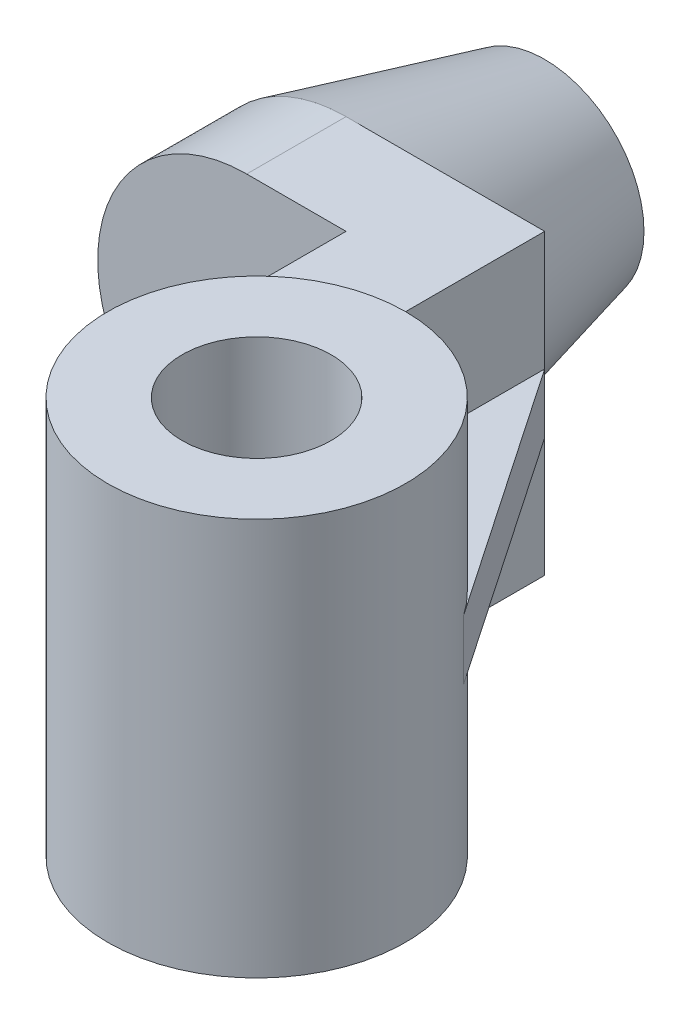
ISO-10303-21;
HEADER;
FILE_DESCRIPTION(('STEP AP214'),'2;1');
FILE_NAME('part.step','',(''),(''),'','','');
FILE_SCHEMA(('AUTOMOTIVE_DESIGN { 1 0 10303 214 1 1 1 1 }'));
ENDSEC;
DATA;
#1=APPLICATION_CONTEXT('core data for automotive mechanical design processes');
#2=APPLICATION_PROTOCOL_DEFINITION('international standard','automotive_design',2000,#1);
#3=PRODUCT_CONTEXT('',#1,'mechanical');
#4=PRODUCT('Part','Part','',(#3));
#5=PRODUCT_RELATED_PRODUCT_CATEGORY('part','',(#4));
#6=PRODUCT_DEFINITION_FORMATION('','',#4);
#7=PRODUCT_DEFINITION_CONTEXT('part definition',#1,'design');
#8=PRODUCT_DEFINITION('design','',#6,#7);
#9=PRODUCT_DEFINITION_SHAPE('','',#8);
#10=(LENGTH_UNIT() NAMED_UNIT(*) SI_UNIT(.MILLI.,.METRE.));
#11=(NAMED_UNIT(*) PLANE_ANGLE_UNIT() SI_UNIT($,.RADIAN.));
#12=(NAMED_UNIT(*) SI_UNIT($,.STERADIAN.) SOLID_ANGLE_UNIT());
#13=UNCERTAINTY_MEASURE_WITH_UNIT(LENGTH_MEASURE(1.E-05),#10,'distance_accuracy_value','');
#14=(GEOMETRIC_REPRESENTATION_CONTEXT(3) GLOBAL_UNCERTAINTY_ASSIGNED_CONTEXT((#13)) GLOBAL_UNIT_ASSIGNED_CONTEXT((#10,
#11,#12)) REPRESENTATION_CONTEXT('',''));
#15=CARTESIAN_POINT('',(0.,0.,0.));
#16=DIRECTION('',(0.,0.,1.));
#17=DIRECTION('',(1.,0.,0.));
#18=AXIS2_PLACEMENT_3D('',#15,#16,#17);
#19=CARTESIAN_POINT('',(-10.,30.,-68.));
#20=DIRECTION('',(-1.,0.,0.));
#21=DIRECTION('',(0.,0.,1.));
#22=AXIS2_PLACEMENT_3D('',#19,#20,#21);
#23=PLANE('',#22);
#24=DIRECTION('',(0.,0.,-1.));
#25=VECTOR('',#24,1.);
#26=CARTESIAN_POINT('',(-10.,-6.,-68.));
#27=LINE('',#26,#25);
#28=CARTESIAN_POINT('',(-10.,-6.,-28.2842712474619));
#29=VERTEX_POINT('',#28);
#30=CARTESIAN_POINT('',(-10.,-6.,-68.));
#31=VERTEX_POINT('',#30);
#32=EDGE_CURVE('E118',#29,#31,#27,.T.);
#33=ORIENTED_EDGE('',*,*,#32,.F.);
#34=DIRECTION('',(0.,-1.,0.));
#35=VECTOR('',#34,1.);
#36=CARTESIAN_POINT('',(-10.,30.,-28.2842712474619));
#37=LINE('',#36,#35);
#38=CARTESIAN_POINT('',(-10.,-30.,-28.2842712474619));
#39=VERTEX_POINT('',#38);
#40=EDGE_CURVE('E124',#29,#39,#37,.T.);
#41=ORIENTED_EDGE('',*,*,#40,.T.);
#42=DIRECTION('',(0.,0.,-1.));
#43=VECTOR('',#42,1.);
#44=CARTESIAN_POINT('',(-10.,-30.,-68.));
#45=LINE('',#44,#43);
#46=CARTESIAN_POINT('',(-10.,-30.,-68.));
#47=VERTEX_POINT('',#46);
#48=EDGE_CURVE('E167',#39,#47,#45,.T.);
#49=ORIENTED_EDGE('',*,*,#48,.T.);
#50=DIRECTION('',(0.,-1.,0.));
#51=VECTOR('',#50,1.);
#52=CARTESIAN_POINT('',(-10.,30.,-68.));
#53=LINE('',#52,#51);
#54=EDGE_CURVE('E184',#31,#47,#53,.T.);
#55=ORIENTED_EDGE('',*,*,#54,.F.);
#56=EDGE_LOOP('',(#33,#41,#49,#55));
#57=FACE_BOUND('',#56,.T.);
#58=ADVANCED_FACE('F33',(#57),#23,.F.);
#59=CARTESIAN_POINT('',(0.,40.,0.));
#60=DIRECTION('',(0.,1.,0.));
#61=DIRECTION('',(0.,0.,1.));
#62=AXIS2_PLACEMENT_3D('',#59,#60,#61);
#63=PLANE('',#62);
#64=CARTESIAN_POINT('',(0.,40.,0.));
#65=DIRECTION('',(0.,1.,0.));
#66=DIRECTION('',(0.,0.,1.));
#67=AXIS2_PLACEMENT_3D('',#64,#65,#66);
#68=CIRCLE('',#67,30.);
#69=CARTESIAN_POINT('',(0.,40.,30.));
#70=VERTEX_POINT('',#69);
#71=EDGE_CURVE('E137',#70,#70,#68,.T.);
#72=ORIENTED_EDGE('',*,*,#71,.T.);
#73=EDGE_LOOP('',(#72));
#74=FACE_BOUND('',#73,.T.);
#75=CARTESIAN_POINT('',(0.,40.,0.));
#76=DIRECTION('',(0.,1.,0.));
#77=DIRECTION('',(0.,0.,1.));
#78=AXIS2_PLACEMENT_3D('',#75,#76,#77);
#79=CIRCLE('',#78,15.);
#80=CARTESIAN_POINT('',(0.,40.,15.));
#81=VERTEX_POINT('',#80);
#82=EDGE_CURVE('E190',#81,#81,#79,.T.);
#83=ORIENTED_EDGE('',*,*,#82,.F.);
#84=EDGE_LOOP('',(#83));
#85=FACE_BOUND('',#84,.T.);
#86=ADVANCED_FACE('F204',(#74,#85),#63,.T.);
#87=CARTESIAN_POINT('',(0.,-40.,0.));
#88=DIRECTION('',(0.,1.,0.));
#89=DIRECTION('',(0.,0.,1.));
#90=AXIS2_PLACEMENT_3D('',#87,#88,#89);
#91=PLANE('',#90);
#92=CARTESIAN_POINT('',(0.,-40.,0.));
#93=DIRECTION('',(0.,1.,0.));
#94=DIRECTION('',(0.,0.,1.));
#95=AXIS2_PLACEMENT_3D('',#92,#93,#94);
#96=CIRCLE('',#95,30.);
#97=CARTESIAN_POINT('',(0.,-40.,30.));
#98=VERTEX_POINT('',#97);
#99=EDGE_CURVE('E37',#98,#98,#96,.T.);
#100=ORIENTED_EDGE('',*,*,#99,.F.);
#101=EDGE_LOOP('',(#100));
#102=FACE_BOUND('',#101,.T.);
#103=CARTESIAN_POINT('',(0.,-40.,0.));
#104=DIRECTION('',(0.,1.,0.));
#105=DIRECTION('',(0.,0.,1.));
#106=AXIS2_PLACEMENT_3D('',#103,#104,#105);
#107=CIRCLE('',#106,15.);
#108=CARTESIAN_POINT('',(0.,-40.,15.));
#109=VERTEX_POINT('',#108);
#110=EDGE_CURVE('E189',#109,#109,#107,.T.);
#111=ORIENTED_EDGE('',*,*,#110,.T.);
#112=EDGE_LOOP('',(#111));
#113=FACE_BOUND('',#112,.T.);
#114=ADVANCED_FACE('F201',(#102,#113),#91,.F.);
#115=CARTESIAN_POINT('',(0.,40.,0.));
#116=DIRECTION('',(0.,-1.,0.));
#117=DIRECTION('',(0.,0.,-1.));
#118=AXIS2_PLACEMENT_3D('',#115,#116,#117);
#119=CYLINDRICAL_SURFACE('',#118,30.);
#120=DIRECTION('',(0.,-1.,0.));
#121=VECTOR('',#120,1.);
#122=CARTESIAN_POINT('',(-30.,30.,0.));
#123=LINE('',#122,#121);
#124=CARTESIAN_POINT('',(-30.,30.,0.));
#125=VERTEX_POINT('',#124);
#126=CARTESIAN_POINT('',(-30.,-30.,0.));
#127=VERTEX_POINT('',#126);
#128=EDGE_CURVE('E165',#125,#127,#123,.T.);
#129=ORIENTED_EDGE('',*,*,#128,.T.);
#130=CARTESIAN_POINT('',(0.,-30.,0.));
#131=DIRECTION('',(0.,-1.,0.));
#132=DIRECTION('',(0.,0.,1.));
#133=AXIS2_PLACEMENT_3D('',#130,#131,#132);
#134=CIRCLE('',#133,30.);
#135=EDGE_CURVE('E146',#127,#39,#134,.T.);
#136=ORIENTED_EDGE('',*,*,#135,.T.);
#137=ORIENTED_EDGE('',*,*,#40,.F.);
#138=CARTESIAN_POINT('',(0.,-6.,0.));
#139=DIRECTION('',(0.,1.,0.));
#140=DIRECTION('',(0.,0.,1.));
#141=AXIS2_PLACEMENT_3D('',#138,#139,#140);
#142=CIRCLE('',#141,30.);
#143=CARTESIAN_POINT('',(24.7990132606522,-6.,-16.8822078324488));
#144=VERTEX_POINT('',#143);
#145=EDGE_CURVE('E116',#144,#29,#142,.T.);
#146=ORIENTED_EDGE('',*,*,#145,.F.);
#147=DIRECTION('',(0.,-1.,0.));
#148=VECTOR('',#147,1.);
#149=CARTESIAN_POINT('',(24.7990132606522,40.,-16.8822078324488));
#150=LINE('',#149,#148);
#151=CARTESIAN_POINT('',(24.7990132606522,6.,-16.8822078324488));
#152=VERTEX_POINT('',#151);
#153=EDGE_CURVE('E106',#144,#152,#150,.F.);
#154=ORIENTED_EDGE('',*,*,#153,.T.);
#155=CARTESIAN_POINT('',(0.,6.,0.));
#156=DIRECTION('',(0.,1.,0.));
#157=DIRECTION('',(0.,0.,1.));
#158=AXIS2_PLACEMENT_3D('',#155,#156,#157);
#159=CIRCLE('',#158,30.);
#160=CARTESIAN_POINT('',(-10.,6.,-28.2842712474619));
#161=VERTEX_POINT('',#160);
#162=EDGE_CURVE('E126',#152,#161,#159,.T.);
#163=ORIENTED_EDGE('',*,*,#162,.T.);
#164=CARTESIAN_POINT('',(-10.,30.,-28.2842712474619));
#165=VERTEX_POINT('',#164);
#166=EDGE_CURVE('E58',#165,#161,#37,.T.);
#167=ORIENTED_EDGE('',*,*,#166,.F.);
#168=CARTESIAN_POINT('',(0.,30.,0.));
#169=DIRECTION('',(0.,-1.,0.));
#170=DIRECTION('',(0.,0.,1.));
#171=AXIS2_PLACEMENT_3D('',#168,#169,#170);
#172=CIRCLE('',#171,30.);
#173=EDGE_CURVE('E148',#125,#165,#172,.T.);
#174=ORIENTED_EDGE('',*,*,#173,.F.);
#175=EDGE_LOOP('',(#129,#136,#137,#146,#154,#163,#167,#174));
#176=FACE_BOUND('',#175,.T.);
#177=ORIENTED_EDGE('',*,*,#71,.F.);
#178=EDGE_LOOP('',(#177));
#179=FACE_BOUND('',#178,.T.);
#180=ORIENTED_EDGE('',*,*,#99,.T.);
#181=EDGE_LOOP('',(#180));
#182=FACE_BOUND('',#181,.T.);
#183=ADVANCED_FACE('F35',(#176,#179,#182),#119,.T.);
#184=CARTESIAN_POINT('',(0.,40.,0.));
#185=DIRECTION('',(0.,-1.,0.));
#186=DIRECTION('',(0.,0.,-1.));
#187=AXIS2_PLACEMENT_3D('',#184,#185,#186);
#188=CYLINDRICAL_SURFACE('',#187,15.);
#189=ORIENTED_EDGE('',*,*,#82,.T.);
#190=EDGE_LOOP('',(#189));
#191=FACE_BOUND('',#190,.T.);
#192=ORIENTED_EDGE('',*,*,#110,.F.);
#193=EDGE_LOOP('',(#192));
#194=FACE_BOUND('',#193,.T.);
#195=ADVANCED_FACE('F207',(#191,#194),#188,.F.);
#196=ORIENTED_EDGE('',*,*,#166,.T.);
#197=DIRECTION('',(0.,0.,-1.));
#198=VECTOR('',#197,1.);
#199=CARTESIAN_POINT('',(-10.,6.,-68.));
#200=LINE('',#199,#198);
#201=CARTESIAN_POINT('',(-10.,6.,-68.));
#202=VERTEX_POINT('',#201);
#203=EDGE_CURVE('E131',#161,#202,#200,.T.);
#204=ORIENTED_EDGE('',*,*,#203,.T.);
#205=CARTESIAN_POINT('',(-10.,30.,-68.));
#206=VERTEX_POINT('',#205);
#207=EDGE_CURVE('E185',#206,#202,#53,.T.);
#208=ORIENTED_EDGE('',*,*,#207,.F.);
#209=DIRECTION('',(0.,0.,-1.));
#210=VECTOR('',#209,1.);
#211=CARTESIAN_POINT('',(-10.,30.,-68.));
#212=LINE('',#211,#210);
#213=EDGE_CURVE('E151',#165,#206,#212,.T.);
#214=ORIENTED_EDGE('',*,*,#213,.F.);
#215=EDGE_LOOP('',(#196,#204,#208,#214));
#216=FACE_BOUND('',#215,.T.);
#217=ADVANCED_FACE('F209',(#216),#23,.F.);
#218=CARTESIAN_POINT('',(-50.,30.,-68.));
#219=DIRECTION('',(0.,0.,1.));
#220=DIRECTION('',(1.,0.,0.));
#221=AXIS2_PLACEMENT_3D('',#218,#219,#220);
#222=PLANE('',#221);
#223=ORIENTED_EDGE('',*,*,#207,.T.);
#224=DIRECTION('',(0.,-1.,0.));
#225=VECTOR('',#224,1.);
#226=CARTESIAN_POINT('',(-10.,30.,-68.));
#227=LINE('',#226,#225);
#228=EDGE_CURVE('E112',#31,#202,#227,.F.);
#229=ORIENTED_EDGE('',*,*,#228,.F.);
#230=ORIENTED_EDGE('',*,*,#54,.T.);
#231=DIRECTION('',(-1.,0.,0.));
#232=VECTOR('',#231,1.);
#233=CARTESIAN_POINT('',(-50.,-30.,-68.));
#234=LINE('',#233,#232);
#235=CARTESIAN_POINT('',(-50.,-30.,-68.));
#236=VERTEX_POINT('',#235);
#237=EDGE_CURVE('E170',#47,#236,#234,.T.);
#238=ORIENTED_EDGE('',*,*,#237,.T.);
#239=CARTESIAN_POINT('',(-50.,0.,-68.));
#240=DIRECTION('',(0.,0.,1.));
#241=DIRECTION('',(1.,0.,0.));
#242=AXIS2_PLACEMENT_3D('',#239,#240,#241);
#243=CIRCLE('',#242,30.);
#244=CARTESIAN_POINT('',(-50.,30.,-68.));
#245=VERTEX_POINT('',#244);
#246=EDGE_CURVE('E42',#236,#245,#243,.T.);
#247=ORIENTED_EDGE('',*,*,#246,.T.);
#248=DIRECTION('',(-1.,0.,0.));
#249=VECTOR('',#248,1.);
#250=CARTESIAN_POINT('',(-30.,30.,-68.));
#251=LINE('',#250,#249);
#252=EDGE_CURVE('E154',#206,#245,#251,.T.);
#253=ORIENTED_EDGE('',*,*,#252,.F.);
#254=EDGE_LOOP('',(#223,#229,#230,#238,#247,#253));
#255=FACE_BOUND('',#254,.T.);
#256=ADVANCED_FACE('F216',(#255),#222,.F.);
#257=CARTESIAN_POINT('',(-30.,30.,-48.));
#258=DIRECTION('',(0.,0.,-1.));
#259=DIRECTION('',(-1.,0.,0.));
#260=AXIS2_PLACEMENT_3D('',#257,#258,#259);
#261=PLANE('',#260);
#262=DIRECTION('',(1.,0.,0.));
#263=VECTOR('',#262,1.);
#264=CARTESIAN_POINT('',(-30.,30.,-48.));
#265=LINE('',#264,#263);
#266=CARTESIAN_POINT('',(-50.,30.,-48.));
#267=VERTEX_POINT('',#266);
#268=CARTESIAN_POINT('',(-30.,30.,-48.));
#269=VERTEX_POINT('',#268);
#270=EDGE_CURVE('E160',#267,#269,#265,.T.);
#271=ORIENTED_EDGE('',*,*,#270,.F.);
#272=CARTESIAN_POINT('',(-50.,0.,-48.));
#273=DIRECTION('',(0.,0.,-1.));
#274=DIRECTION('',(-1.,0.,0.));
#275=AXIS2_PLACEMENT_3D('',#272,#273,#274);
#276=CIRCLE('',#275,30.);
#277=CARTESIAN_POINT('',(-50.,-30.,-48.));
#278=VERTEX_POINT('',#277);
#279=EDGE_CURVE('E144',#278,#267,#276,.T.);
#280=ORIENTED_EDGE('',*,*,#279,.F.);
#281=DIRECTION('',(1.,0.,0.));
#282=VECTOR('',#281,1.);
#283=CARTESIAN_POINT('',(-30.,-30.,-48.));
#284=LINE('',#283,#282);
#285=CARTESIAN_POINT('',(-30.,-30.,-48.));
#286=VERTEX_POINT('',#285);
#287=EDGE_CURVE('E176',#278,#286,#284,.T.);
#288=ORIENTED_EDGE('',*,*,#287,.T.);
#289=DIRECTION('',(0.,-1.,0.));
#290=VECTOR('',#289,1.);
#291=CARTESIAN_POINT('',(-30.,30.,-48.));
#292=LINE('',#291,#290);
#293=EDGE_CURVE('E182',#269,#286,#292,.T.);
#294=ORIENTED_EDGE('',*,*,#293,.F.);
#295=EDGE_LOOP('',(#271,#280,#288,#294));
#296=FACE_BOUND('',#295,.T.);
#297=ADVANCED_FACE('F229',(#296),#261,.F.);
#298=CARTESIAN_POINT('',(-30.,30.,0.));
#299=DIRECTION('',(1.,0.,0.));
#300=DIRECTION('',(0.,0.,-1.));
#301=AXIS2_PLACEMENT_3D('',#298,#299,#300);
#302=PLANE('',#301);
#303=ORIENTED_EDGE('',*,*,#293,.T.);
#304=DIRECTION('',(0.,0.,1.));
#305=VECTOR('',#304,1.);
#306=CARTESIAN_POINT('',(-30.,-30.,0.));
#307=LINE('',#306,#305);
#308=EDGE_CURVE('E152',#286,#127,#307,.T.);
#309=ORIENTED_EDGE('',*,*,#308,.T.);
#310=ORIENTED_EDGE('',*,*,#128,.F.);
#311=DIRECTION('',(0.,0.,1.));
#312=VECTOR('',#311,1.);
#313=CARTESIAN_POINT('',(-30.,30.,0.));
#314=LINE('',#313,#312);
#315=EDGE_CURVE('E162',#269,#125,#314,.T.);
#316=ORIENTED_EDGE('',*,*,#315,.F.);
#317=EDGE_LOOP('',(#303,#309,#310,#316));
#318=FACE_BOUND('',#317,.T.);
#319=ADVANCED_FACE('F234',(#318),#302,.F.);
#320=CARTESIAN_POINT('',(0.,30.,0.));
#321=DIRECTION('',(0.,1.,0.));
#322=DIRECTION('',(0.,0.,1.));
#323=AXIS2_PLACEMENT_3D('',#320,#321,#322);
#324=PLANE('',#323);
#325=ORIENTED_EDGE('',*,*,#173,.T.);
#326=ORIENTED_EDGE('',*,*,#213,.T.);
#327=ORIENTED_EDGE('',*,*,#252,.T.);
#328=DIRECTION('',(0.,0.,1.));
#329=VECTOR('',#328,1.);
#330=CARTESIAN_POINT('',(-50.,30.,-48.));
#331=LINE('',#330,#329);
#332=EDGE_CURVE('E157',#245,#267,#331,.T.);
#333=ORIENTED_EDGE('',*,*,#332,.T.);
#334=ORIENTED_EDGE('',*,*,#270,.T.);
#335=ORIENTED_EDGE('',*,*,#315,.T.);
#336=EDGE_LOOP('',(#325,#326,#327,#333,#334,#335));
#337=FACE_BOUND('',#336,.T.);
#338=ADVANCED_FACE('F238',(#337),#324,.T.);
#339=CARTESIAN_POINT('',(0.,-30.,0.));
#340=DIRECTION('',(0.,1.,0.));
#341=DIRECTION('',(0.,0.,1.));
#342=AXIS2_PLACEMENT_3D('',#339,#340,#341);
#343=PLANE('',#342);
#344=ORIENTED_EDGE('',*,*,#135,.F.);
#345=ORIENTED_EDGE('',*,*,#308,.F.);
#346=ORIENTED_EDGE('',*,*,#287,.F.);
#347=DIRECTION('',(0.,0.,1.));
#348=VECTOR('',#347,1.);
#349=CARTESIAN_POINT('',(-50.,-30.,-48.));
#350=LINE('',#349,#348);
#351=EDGE_CURVE('E173',#236,#278,#350,.T.);
#352=ORIENTED_EDGE('',*,*,#351,.F.);
#353=ORIENTED_EDGE('',*,*,#237,.F.);
#354=ORIENTED_EDGE('',*,*,#48,.F.);
#355=EDGE_LOOP('',(#344,#345,#346,#352,#353,#354));
#356=FACE_BOUND('',#355,.T.);
#357=ADVANCED_FACE('F240',(#356),#343,.F.);
#358=CARTESIAN_POINT('',(-50.,0.,-48.));
#359=DIRECTION('',(0.,0.,-1.));
#360=DIRECTION('',(-1.,0.,0.));
#361=AXIS2_PLACEMENT_3D('',#358,#359,#360);
#362=CYLINDRICAL_SURFACE('',#361,30.);
#363=ORIENTED_EDGE('',*,*,#332,.F.);
#364=CARTESIAN_POINT('',(-50.,0.,-68.));
#365=DIRECTION('',(0.,0.,-1.));
#366=DIRECTION('',(-1.,0.,0.));
#367=AXIS2_PLACEMENT_3D('',#364,#365,#366);
#368=CIRCLE('',#367,30.);
#369=EDGE_CURVE('E142',#236,#245,#368,.T.);
#370=ORIENTED_EDGE('',*,*,#369,.F.);
#371=ORIENTED_EDGE('',*,*,#351,.T.);
#372=ORIENTED_EDGE('',*,*,#279,.T.);
#373=EDGE_LOOP('',(#363,#370,#371,#372));
#374=FACE_BOUND('',#373,.T.);
#375=ADVANCED_FACE('F243',(#374),#362,.T.);
#376=CARTESIAN_POINT('',(-50.,0.,-68.));
#377=DIRECTION('',(0.,0.,1.));
#378=DIRECTION('',(1.,0.,0.));
#379=AXIS2_PLACEMENT_3D('',#376,#377,#378);
#380=CYLINDRICAL_SURFACE('',#379,10.);
#381=CARTESIAN_POINT('',(-50.,0.,-108.));
#382=DIRECTION('',(0.,0.,1.));
#383=DIRECTION('',(1.,0.,0.));
#384=AXIS2_PLACEMENT_3D('',#381,#382,#383);
#385=CIRCLE('',#384,10.);
#386=CARTESIAN_POINT('',(-40.,0.,-108.));
#387=VERTEX_POINT('',#386);
#388=EDGE_CURVE('E140',#387,#387,#385,.T.);
#389=ORIENTED_EDGE('',*,*,#388,.F.);
#390=EDGE_LOOP('',(#389));
#391=FACE_BOUND('',#390,.T.);
#392=CARTESIAN_POINT('',(-50.,0.,-68.));
#393=DIRECTION('',(0.,0.,1.));
#394=DIRECTION('',(1.,0.,0.));
#395=AXIS2_PLACEMENT_3D('',#392,#393,#394);
#396=CIRCLE('',#395,9.99999999999999);
#397=CARTESIAN_POINT('',(-40.,0.,-68.));
#398=VERTEX_POINT('',#397);
#399=EDGE_CURVE('E11',#398,#398,#396,.T.);
#400=ORIENTED_EDGE('',*,*,#399,.T.);
#401=EDGE_LOOP('',(#400));
#402=FACE_BOUND('',#401,.T.);
#403=ADVANCED_FACE('F250',(#391,#402),#380,.F.);
#404=CARTESIAN_POINT('',(-70.,0.,-108.));
#405=DIRECTION('',(0.,0.,1.));
#406=DIRECTION('',(1.,0.,0.));
#407=AXIS2_PLACEMENT_3D('',#404,#405,#406);
#408=PLANE('',#407);
#409=ORIENTED_EDGE('',*,*,#388,.T.);
#410=EDGE_LOOP('',(#409));
#411=FACE_BOUND('',#410,.T.);
#412=CARTESIAN_POINT('',(-50.,0.,-108.));
#413=DIRECTION('',(0.,0.,1.));
#414=DIRECTION('',(1.,0.,0.));
#415=AXIS2_PLACEMENT_3D('',#412,#413,#414);
#416=CIRCLE('',#415,20.);
#417=CARTESIAN_POINT('',(-30.,0.,-108.));
#418=VERTEX_POINT('',#417);
#419=EDGE_CURVE('E111',#418,#418,#416,.T.);
#420=ORIENTED_EDGE('',*,*,#419,.F.);
#421=EDGE_LOOP('',(#420));
#422=FACE_BOUND('',#421,.T.);
#423=ADVANCED_FACE('F254',(#411,#422),#408,.F.);
#424=CARTESIAN_POINT('',(-50.,0.,-108.));
#425=DIRECTION('',(0.,0.,1.));
#426=DIRECTION('',(1.,0.,0.));
#427=AXIS2_PLACEMENT_3D('',#424,#425,#426);
#428=CONICAL_SURFACE('',#427,20.,0.244978663126864);
#429=ORIENTED_EDGE('',*,*,#369,.T.);
#430=ORIENTED_EDGE('',*,*,#246,.F.);
#431=EDGE_LOOP('',(#429,#430));
#432=FACE_BOUND('',#431,.T.);
#433=ORIENTED_EDGE('',*,*,#419,.T.);
#434=EDGE_LOOP('',(#433));
#435=FACE_BOUND('',#434,.T.);
#436=ADVANCED_FACE('F258',(#432,#435),#428,.T.);
#437=ORIENTED_EDGE('',*,*,#399,.F.);
#438=EDGE_LOOP('',(#437));
#439=FACE_BOUND('',#438,.T.);
#440=ADVANCED_FACE('F231',(#439),#222,.F.);
#441=CARTESIAN_POINT('',(-10.,0.,-68.));
#442=DIRECTION('',(-0.826633775355073,0.,0.562740261081628));
#443=DIRECTION('',(0.562740261081628,0.,0.826633775355073));
#444=AXIS2_PLACEMENT_3D('',#441,#442,#443);
#445=PLANE('',#444);
#446=ORIENTED_EDGE('',*,*,#153,.F.);
#447=DIRECTION('',(0.562740261081628,0.,0.826633775355073));
#448=VECTOR('',#447,1.);
#449=CARTESIAN_POINT('',(-10.,-6.,-68.));
#450=LINE('',#449,#448);
#451=EDGE_CURVE('E50',#31,#144,#450,.T.);
#452=ORIENTED_EDGE('',*,*,#451,.F.);
#453=ORIENTED_EDGE('',*,*,#228,.T.);
#454=DIRECTION('',(0.562740261081628,0.,0.826633775355073));
#455=VECTOR('',#454,1.);
#456=CARTESIAN_POINT('',(-10.,6.,-68.));
#457=LINE('',#456,#455);
#458=EDGE_CURVE('E109',#202,#152,#457,.T.);
#459=ORIENTED_EDGE('',*,*,#458,.T.);
#460=EDGE_LOOP('',(#446,#452,#453,#459));
#461=FACE_BOUND('',#460,.T.);
#462=ADVANCED_FACE('F107',(#461),#445,.F.);
#463=CARTESIAN_POINT('',(-25.,6.,-39.));
#464=DIRECTION('',(0.,1.,0.));
#465=DIRECTION('',(0.,0.,1.));
#466=AXIS2_PLACEMENT_3D('',#463,#464,#465);
#467=PLANE('',#466);
#468=ORIENTED_EDGE('',*,*,#203,.F.);
#469=ORIENTED_EDGE('',*,*,#162,.F.);
#470=ORIENTED_EDGE('',*,*,#458,.F.);
#471=EDGE_LOOP('',(#468,#469,#470));
#472=FACE_BOUND('',#471,.T.);
#473=ADVANCED_FACE('F265',(#472),#467,.T.);
#474=CARTESIAN_POINT('',(-25.,-6.,-39.));
#475=DIRECTION('',(0.,1.,0.));
#476=DIRECTION('',(0.,0.,1.));
#477=AXIS2_PLACEMENT_3D('',#474,#475,#476);
#478=PLANE('',#477);
#479=ORIENTED_EDGE('',*,*,#145,.T.);
#480=ORIENTED_EDGE('',*,*,#32,.T.);
#481=ORIENTED_EDGE('',*,*,#451,.T.);
#482=EDGE_LOOP('',(#479,#480,#481));
#483=FACE_BOUND('',#482,.T.);
#484=ADVANCED_FACE('F115',(#483),#478,.F.);
#485=CLOSED_SHELL('',(#58,#86,#114,#183,#195,#217,#256,#297,#319,#338,#357,#375,#403,#423,#436,
#440,#462,#473,#484));
#486=MANIFOLD_SOLID_BREP('B2',#485);
#487=ADVANCED_BREP_SHAPE_REPRESENTATION('',(#18,#486),#14);
#488=SHAPE_DEFINITION_REPRESENTATION(#9,#487);
ENDSEC;
END-ISO-10303-21;
